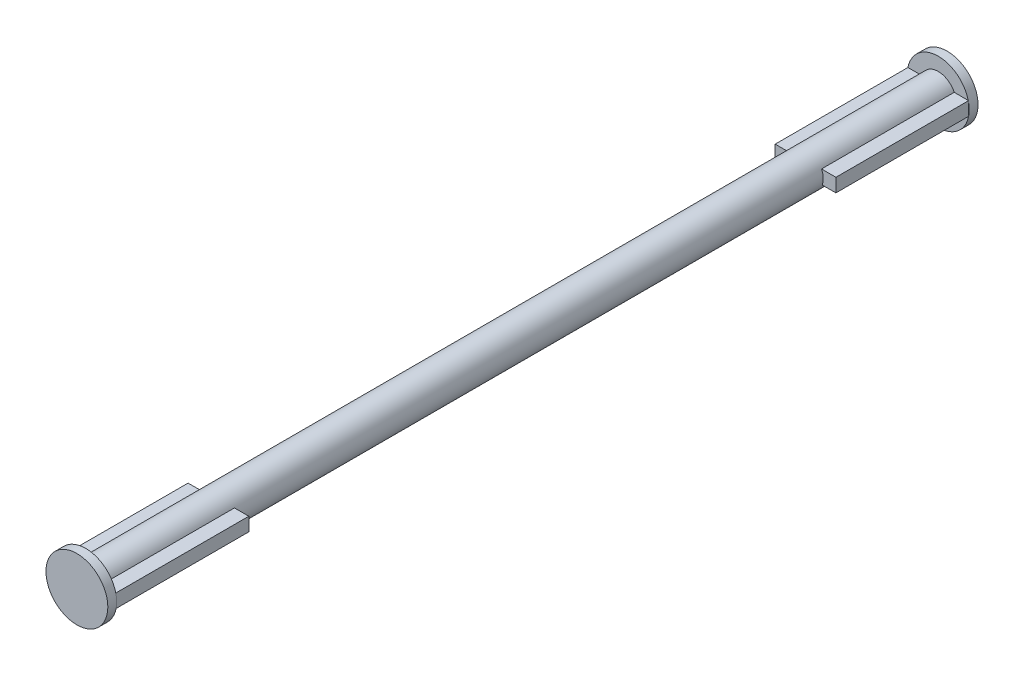
ISO-10303-21;
HEADER;
FILE_DESCRIPTION(('STEP AP214'),'2;1');
FILE_NAME('part.step','',(''),(''),'','','');
FILE_SCHEMA(('AUTOMOTIVE_DESIGN { 1 0 10303 214 1 1 1 1 }'));
ENDSEC;
DATA;
#1=APPLICATION_CONTEXT('core data for automotive mechanical design processes');
#2=APPLICATION_PROTOCOL_DEFINITION('international standard','automotive_design',2000,#1);
#3=PRODUCT_CONTEXT('',#1,'mechanical');
#4=PRODUCT('Part','Part','',(#3));
#5=PRODUCT_RELATED_PRODUCT_CATEGORY('part','',(#4));
#6=PRODUCT_DEFINITION_FORMATION('','',#4);
#7=PRODUCT_DEFINITION_CONTEXT('part definition',#1,'design');
#8=PRODUCT_DEFINITION('design','',#6,#7);
#9=PRODUCT_DEFINITION_SHAPE('','',#8);
#10=(LENGTH_UNIT() NAMED_UNIT(*) SI_UNIT(.MILLI.,.METRE.));
#11=(NAMED_UNIT(*) PLANE_ANGLE_UNIT() SI_UNIT($,.RADIAN.));
#12=(NAMED_UNIT(*) SI_UNIT($,.STERADIAN.) SOLID_ANGLE_UNIT());
#13=UNCERTAINTY_MEASURE_WITH_UNIT(LENGTH_MEASURE(1.E-05),#10,'distance_accuracy_value','');
#14=(GEOMETRIC_REPRESENTATION_CONTEXT(3) GLOBAL_UNCERTAINTY_ASSIGNED_CONTEXT((#13)) GLOBAL_UNIT_ASSIGNED_CONTEXT((#10,
#11,#12)) REPRESENTATION_CONTEXT('',''));
#15=CARTESIAN_POINT('',(0.,0.,0.));
#16=DIRECTION('',(0.,0.,1.));
#17=DIRECTION('',(1.,0.,0.));
#18=AXIS2_PLACEMENT_3D('',#15,#16,#17);
#19=CARTESIAN_POINT('',(0.,0.,0.));
#20=DIRECTION('',(0.,0.,1.));
#21=DIRECTION('',(1.,0.,0.));
#22=AXIS2_PLACEMENT_3D('',#19,#20,#21);
#23=PLANE('',#22);
#24=CARTESIAN_POINT('',(0.,0.,0.));
#25=DIRECTION('',(0.,0.,-1.));
#26=DIRECTION('',(-1.,0.,0.));
#27=AXIS2_PLACEMENT_3D('',#24,#25,#26);
#28=CIRCLE('',#27,17.4831232844675);
#29=CARTESIAN_POINT('',(16.9469713382279,4.29648254286825,0.));
#30=VERTEX_POINT('',#29);
#31=CARTESIAN_POINT('',(17.1568264225371,3.36197960832941,0.));
#32=VERTEX_POINT('',#31);
#33=EDGE_CURVE('E11',#30,#32,#28,.T.);
#34=ORIENTED_EDGE('',*,*,#33,.F.);
#35=DIRECTION('',(-1.,0.,0.));
#36=VECTOR('',#35,1.);
#37=CARTESIAN_POINT('',(9.02996333097917,4.29648254286825,0.));
#38=LINE('',#37,#36);
#39=CARTESIAN_POINT('',(17.1568264225371,4.29648254286825,0.));
#40=VERTEX_POINT('',#39);
#41=EDGE_CURVE('E249',#40,#30,#38,.T.);
#42=ORIENTED_EDGE('',*,*,#41,.F.);
#43=DIRECTION('',(0.,1.,0.));
#44=VECTOR('',#43,1.);
#45=CARTESIAN_POINT('',(17.1568264225371,4.29648254286825,0.));
#46=LINE('',#45,#44);
#47=EDGE_CURVE('E59',#32,#40,#46,.T.);
#48=ORIENTED_EDGE('',*,*,#47,.F.);
#49=EDGE_LOOP('',(#34,#42,#48));
#50=FACE_BOUND('',#49,.T.);
#51=ADVANCED_FACE('F34',(#50),#23,.F.);
#52=CARTESIAN_POINT('',(0.,0.,481.8));
#53=DIRECTION('',(0.,0.,1.));
#54=DIRECTION('',(1.,0.,0.));
#55=AXIS2_PLACEMENT_3D('',#52,#53,#54);
#56=PLANE('',#55);
#57=CARTESIAN_POINT('',(0.,0.,481.8));
#58=DIRECTION('',(0.,0.,1.));
#59=DIRECTION('',(1.,0.,0.));
#60=AXIS2_PLACEMENT_3D('',#57,#58,#59);
#61=CIRCLE('',#60,17.4831232844682);
#62=CARTESIAN_POINT('',(17.1568264225371,3.36197960833326,481.8));
#63=VERTEX_POINT('',#62);
#64=CARTESIAN_POINT('',(16.9469713382286,4.29648254286825,481.8));
#65=VERTEX_POINT('',#64);
#66=EDGE_CURVE('E206',#63,#65,#61,.T.);
#67=ORIENTED_EDGE('',*,*,#66,.F.);
#68=DIRECTION('',(0.,1.,0.));
#69=VECTOR('',#68,1.);
#70=CARTESIAN_POINT('',(17.1568264225371,4.29648254286825,481.8));
#71=LINE('',#70,#69);
#72=CARTESIAN_POINT('',(17.1568264225371,4.29648254286825,481.8));
#73=VERTEX_POINT('',#72);
#74=EDGE_CURVE('E325',#63,#73,#71,.T.);
#75=ORIENTED_EDGE('',*,*,#74,.T.);
#76=DIRECTION('',(-1.,0.,0.));
#77=VECTOR('',#76,1.);
#78=CARTESIAN_POINT('',(9.02996333097916,4.29648254286825,481.8));
#79=LINE('',#78,#77);
#80=EDGE_CURVE('E317',#73,#65,#79,.T.);
#81=ORIENTED_EDGE('',*,*,#80,.T.);
#82=EDGE_LOOP('',(#67,#75,#81));
#83=FACE_BOUND('',#82,.T.);
#84=ADVANCED_FACE('F388',(#83),#56,.T.);
#85=CARTESIAN_POINT('',(0.,0.,481.8));
#86=DIRECTION('',(0.,0.,-1.));
#87=DIRECTION('',(-1.,0.,0.));
#88=AXIS2_PLACEMENT_3D('',#85,#86,#87);
#89=CYLINDRICAL_SURFACE('',#88,10.);
#90=CARTESIAN_POINT('',(0.,0.,481.8));
#91=DIRECTION('',(0.,0.,1.));
#92=DIRECTION('',(1.,0.,0.));
#93=AXIS2_PLACEMENT_3D('',#90,#91,#92);
#94=CIRCLE('',#93,10.);
#95=CARTESIAN_POINT('',(-9.02996333097932,-4.29648254286793,481.8));
#96=VERTEX_POINT('',#95);
#97=CARTESIAN_POINT('',(9.41791341609973,-3.36197960833327,481.8));
#98=VERTEX_POINT('',#97);
#99=EDGE_CURVE('E270',#96,#98,#94,.T.);
#100=ORIENTED_EDGE('',*,*,#99,.F.);
#101=DIRECTION('',(0.,0.,1.));
#102=VECTOR('',#101,1.);
#103=CARTESIAN_POINT('',(-9.02996333097813,-4.29648254286793,406.8));
#104=LINE('',#103,#102);
#105=CARTESIAN_POINT('',(-9.02996333097813,-4.29648254286793,406.8));
#106=VERTEX_POINT('',#105);
#107=EDGE_CURVE('E328',#106,#96,#104,.T.);
#108=ORIENTED_EDGE('',*,*,#107,.F.);
#109=CARTESIAN_POINT('',(2.8117583496154E-13,0.,406.8));
#110=DIRECTION('',(0.,0.,-1.));
#111=DIRECTION('',(1.,0.,0.));
#112=AXIS2_PLACEMENT_3D('',#109,#110,#111);
#113=CIRCLE('',#112,9.99999999999918);
#114=CARTESIAN_POINT('',(-9.41791341609846,3.36197960833361,406.8));
#115=VERTEX_POINT('',#114);
#116=EDGE_CURVE('E351',#106,#115,#113,.T.);
#117=ORIENTED_EDGE('',*,*,#116,.T.);
#118=DIRECTION('',(0.,0.,1.));
#119=VECTOR('',#118,1.);
#120=CARTESIAN_POINT('',(-9.41791341609846,3.36197960833361,406.8));
#121=LINE('',#120,#119);
#122=CARTESIAN_POINT('',(-9.41791341609846,3.36197960833361,481.8));
#123=VERTEX_POINT('',#122);
#124=EDGE_CURVE('E339',#115,#123,#121,.T.);
#125=ORIENTED_EDGE('',*,*,#124,.T.);
#126=CARTESIAN_POINT('',(9.02996333097916,4.29648254286825,481.8));
#127=VERTEX_POINT('',#126);
#128=EDGE_CURVE('E204',#127,#123,#94,.T.);
#129=ORIENTED_EDGE('',*,*,#128,.F.);
#130=DIRECTION('',(0.,0.,1.));
#131=VECTOR('',#130,1.);
#132=CARTESIAN_POINT('',(9.02996333097916,4.29648254286825,406.8));
#133=LINE('',#132,#131);
#134=CARTESIAN_POINT('',(9.02996333097916,4.29648254286825,406.8));
#135=VERTEX_POINT('',#134);
#136=EDGE_CURVE('E297',#135,#127,#133,.T.);
#137=ORIENTED_EDGE('',*,*,#136,.F.);
#138=CARTESIAN_POINT('',(2.8117583496154E-13,0.,406.8));
#139=DIRECTION('',(0.,0.,-1.));
#140=DIRECTION('',(1.,0.,0.));
#141=AXIS2_PLACEMENT_3D('',#138,#139,#140);
#142=CIRCLE('',#141,9.99999999999974);
#143=CARTESIAN_POINT('',(9.41791341609973,-3.36197960833327,406.8));
#144=VERTEX_POINT('',#143);
#145=EDGE_CURVE('E320',#135,#144,#142,.T.);
#146=ORIENTED_EDGE('',*,*,#145,.T.);
#147=DIRECTION('',(0.,0.,1.));
#148=VECTOR('',#147,1.);
#149=CARTESIAN_POINT('',(9.41791341609973,-3.36197960833327,406.8));
#150=LINE('',#149,#148);
#151=EDGE_CURVE('E309',#144,#98,#150,.T.);
#152=ORIENTED_EDGE('',*,*,#151,.T.);
#153=EDGE_LOOP('',(#100,#108,#117,#125,#129,#137,#146,#152));
#154=FACE_BOUND('',#153,.T.);
#155=DIRECTION('',(0.,0.,-1.));
#156=VECTOR('',#155,1.);
#157=CARTESIAN_POINT('',(-9.41791341609781,3.36197960833656,75.));
#158=LINE('',#157,#156);
#159=CARTESIAN_POINT('',(-9.41791341609847,3.3619796083368,75.));
#160=VERTEX_POINT('',#159);
#161=CARTESIAN_POINT('',(-9.41791341609855,3.36197960833656,0.));
#162=VERTEX_POINT('',#161);
#163=EDGE_CURVE('E242',#160,#162,#158,.T.);
#164=ORIENTED_EDGE('',*,*,#163,.F.);
#165=CARTESIAN_POINT('',(3.81639164714898E-13,0.,75.));
#166=DIRECTION('',(0.,0.,-1.));
#167=DIRECTION('',(-1.,0.,0.));
#168=AXIS2_PLACEMENT_3D('',#165,#166,#167);
#169=CIRCLE('',#168,9.99999999999965);
#170=CARTESIAN_POINT('',(-9.02996333098052,-4.2964825428654,75.));
#171=VERTEX_POINT('',#170);
#172=EDGE_CURVE('E233',#171,#160,#169,.T.);
#173=ORIENTED_EDGE('',*,*,#172,.F.);
#174=DIRECTION('',(0.,0.,-1.));
#175=VECTOR('',#174,1.);
#176=CARTESIAN_POINT('',(-9.02996333097988,-4.2964825428651,75.));
#177=LINE('',#176,#175);
#178=CARTESIAN_POINT('',(-9.02996333097988,-4.2964825428651,0.));
#179=VERTEX_POINT('',#178);
#180=EDGE_CURVE('E236',#171,#179,#177,.T.);
#181=ORIENTED_EDGE('',*,*,#180,.T.);
#182=CARTESIAN_POINT('',(0.,0.,0.));
#183=DIRECTION('',(0.,0.,1.));
#184=DIRECTION('',(1.,0.,0.));
#185=AXIS2_PLACEMENT_3D('',#182,#183,#184);
#186=CIRCLE('',#185,10.);
#187=CARTESIAN_POINT('',(9.41791341609973,-3.36197960833327,0.));
#188=VERTEX_POINT('',#187);
#189=EDGE_CURVE('E228',#179,#188,#186,.T.);
#190=ORIENTED_EDGE('',*,*,#189,.T.);
#191=DIRECTION('',(0.,0.,-1.));
#192=VECTOR('',#191,1.);
#193=CARTESIAN_POINT('',(9.41791341609973,-3.36197960833327,75.));
#194=LINE('',#193,#192);
#195=CARTESIAN_POINT('',(9.41791341609973,-3.36197960833327,75.));
#196=VERTEX_POINT('',#195);
#197=EDGE_CURVE('E267',#196,#188,#194,.T.);
#198=ORIENTED_EDGE('',*,*,#197,.F.);
#199=CARTESIAN_POINT('',(3.81639164714898E-13,0.,75.));
#200=DIRECTION('',(0.,0.,-1.));
#201=DIRECTION('',(-1.,0.,0.));
#202=AXIS2_PLACEMENT_3D('',#199,#200,#201);
#203=CIRCLE('',#202,9.99999999999965);
#204=CARTESIAN_POINT('',(9.02996333097916,4.29648254286825,75.));
#205=VERTEX_POINT('',#204);
#206=EDGE_CURVE('E245',#205,#196,#203,.T.);
#207=ORIENTED_EDGE('',*,*,#206,.F.);
#208=DIRECTION('',(0.,0.,-1.));
#209=VECTOR('',#208,1.);
#210=CARTESIAN_POINT('',(9.02996333097917,4.29648254286825,75.));
#211=LINE('',#210,#209);
#212=CARTESIAN_POINT('',(9.02996333097917,4.29648254286825,0.));
#213=VERTEX_POINT('',#212);
#214=EDGE_CURVE('E256',#205,#213,#211,.T.);
#215=ORIENTED_EDGE('',*,*,#214,.T.);
#216=EDGE_CURVE('E38',#213,#162,#186,.T.);
#217=ORIENTED_EDGE('',*,*,#216,.T.);
#218=EDGE_LOOP('',(#164,#173,#181,#190,#198,#207,#215,#217));
#219=FACE_BOUND('',#218,.T.);
#220=ADVANCED_FACE('F36',(#154,#219),#89,.T.);
#221=CARTESIAN_POINT('',(-17.156826422536,-3.36197960833873,481.8));
#222=VERTEX_POINT('',#221);
#223=CARTESIAN_POINT('',(-16.9469713382288,-4.2964825428677,481.8));
#224=VERTEX_POINT('',#223);
#225=EDGE_CURVE('E202',#222,#224,#61,.T.);
#226=ORIENTED_EDGE('',*,*,#225,.F.);
#227=DIRECTION('',(0.,-1.,0.));
#228=VECTOR('',#227,1.);
#229=CARTESIAN_POINT('',(-17.156826422536,-4.29648254286769,481.8));
#230=LINE('',#229,#228);
#231=CARTESIAN_POINT('',(-17.156826422536,-4.29648254286769,481.8));
#232=VERTEX_POINT('',#231);
#233=EDGE_CURVE('E356',#222,#232,#230,.T.);
#234=ORIENTED_EDGE('',*,*,#233,.T.);
#235=DIRECTION('',(1.,0.,0.));
#236=VECTOR('',#235,1.);
#237=CARTESIAN_POINT('',(-9.02996333097813,-4.29648254286793,481.8));
#238=LINE('',#237,#236);
#239=EDGE_CURVE('E349',#232,#224,#238,.T.);
#240=ORIENTED_EDGE('',*,*,#239,.T.);
#241=EDGE_LOOP('',(#226,#234,#240));
#242=FACE_BOUND('',#241,.T.);
#243=ADVANCED_FACE('F420',(#242),#56,.T.);
#244=CARTESIAN_POINT('',(-16.9469713382294,-4.29648254286237,0.));
#245=VERTEX_POINT('',#244);
#246=CARTESIAN_POINT('',(-17.1568264225375,-3.36197960832741,0.));
#247=VERTEX_POINT('',#246);
#248=EDGE_CURVE('E43',#245,#247,#28,.T.);
#249=ORIENTED_EDGE('',*,*,#248,.F.);
#250=DIRECTION('',(1.,-3.44303691993684E-13,0.));
#251=VECTOR('',#250,1.);
#252=CARTESIAN_POINT('',(-9.02996333097988,-4.2964825428651,0.));
#253=LINE('',#252,#251);
#254=CARTESIAN_POINT('',(-17.1568264225378,-4.2964825428623,0.));
#255=VERTEX_POINT('',#254);
#256=EDGE_CURVE('E189',#255,#245,#253,.T.);
#257=ORIENTED_EDGE('',*,*,#256,.F.);
#258=DIRECTION('',(-3.44749256222736E-13,-1.,0.));
#259=VECTOR('',#258,1.);
#260=CARTESIAN_POINT('',(-17.1568264225378,-4.2964825428623,0.));
#261=LINE('',#260,#259);
#262=EDGE_CURVE('E178',#247,#255,#261,.T.);
#263=ORIENTED_EDGE('',*,*,#262,.F.);
#264=EDGE_LOOP('',(#249,#257,#263));
#265=FACE_BOUND('',#264,.T.);
#266=ADVANCED_FACE('F188',(#265),#23,.F.);
#267=CARTESIAN_POINT('',(17.1568264225371,-3.36197960833327,75.));
#268=DIRECTION('',(0.,1.,0.));
#269=DIRECTION('',(-1.,0.,0.));
#270=AXIS2_PLACEMENT_3D('',#267,#268,#269);
#271=PLANE('',#270);
#272=DIRECTION('',(1.,0.,0.));
#273=VECTOR('',#272,1.);
#274=CARTESIAN_POINT('',(17.1568264225371,-3.36197960833327,0.));
#275=LINE('',#274,#273);
#276=CARTESIAN_POINT('',(17.1568264225371,-3.36197960833327,0.));
#277=VERTEX_POINT('',#276);
#278=EDGE_CURVE('E227',#188,#277,#275,.T.);
#279=ORIENTED_EDGE('',*,*,#278,.T.);
#280=DIRECTION('',(0.,0.,-1.));
#281=VECTOR('',#280,1.);
#282=CARTESIAN_POINT('',(17.1568264225371,-3.36197960833327,75.));
#283=LINE('',#282,#281);
#284=CARTESIAN_POINT('',(17.1568264225371,-3.36197960833327,75.));
#285=VERTEX_POINT('',#284);
#286=EDGE_CURVE('E265',#285,#277,#283,.T.);
#287=ORIENTED_EDGE('',*,*,#286,.F.);
#288=DIRECTION('',(1.,0.,0.));
#289=VECTOR('',#288,1.);
#290=CARTESIAN_POINT('',(17.1568264225371,-3.36197960833327,75.));
#291=LINE('',#290,#289);
#292=EDGE_CURVE('E248',#196,#285,#291,.T.);
#293=ORIENTED_EDGE('',*,*,#292,.F.);
#294=ORIENTED_EDGE('',*,*,#197,.T.);
#295=EDGE_LOOP('',(#279,#287,#293,#294));
#296=FACE_BOUND('',#295,.T.);
#297=ADVANCED_FACE('F284',(#296),#271,.F.);
#298=CARTESIAN_POINT('',(17.1568264225371,4.29648254286825,75.));
#299=DIRECTION('',(-1.,0.,0.));
#300=DIRECTION('',(0.,0.,1.));
#301=AXIS2_PLACEMENT_3D('',#298,#299,#300);
#302=PLANE('',#301);
#303=EDGE_CURVE('E217',#277,#32,#46,.T.);
#304=ORIENTED_EDGE('',*,*,#303,.T.);
#305=ORIENTED_EDGE('',*,*,#47,.T.);
#306=DIRECTION('',(0.,0.,-1.));
#307=VECTOR('',#306,1.);
#308=CARTESIAN_POINT('',(17.1568264225371,4.29648254286825,75.));
#309=LINE('',#308,#307);
#310=CARTESIAN_POINT('',(17.1568264225371,4.29648254286825,75.));
#311=VERTEX_POINT('',#310);
#312=EDGE_CURVE('E262',#311,#40,#309,.T.);
#313=ORIENTED_EDGE('',*,*,#312,.F.);
#314=DIRECTION('',(0.,1.,0.));
#315=VECTOR('',#314,1.);
#316=CARTESIAN_POINT('',(17.1568264225371,4.29648254286825,75.));
#317=LINE('',#316,#315);
#318=EDGE_CURVE('E251',#285,#311,#317,.T.);
#319=ORIENTED_EDGE('',*,*,#318,.F.);
#320=ORIENTED_EDGE('',*,*,#286,.T.);
#321=EDGE_LOOP('',(#304,#305,#313,#319,#320));
#322=FACE_BOUND('',#321,.T.);
#323=ADVANCED_FACE('F434',(#322),#302,.F.);
#324=CARTESIAN_POINT('',(9.02996333097917,4.29648254286825,75.));
#325=DIRECTION('',(0.,-1.,0.));
#326=DIRECTION('',(0.,0.,-1.));
#327=AXIS2_PLACEMENT_3D('',#324,#325,#326);
#328=PLANE('',#327);
#329=ORIENTED_EDGE('',*,*,#41,.T.);
#330=EDGE_CURVE('E220',#30,#213,#38,.T.);
#331=ORIENTED_EDGE('',*,*,#330,.T.);
#332=ORIENTED_EDGE('',*,*,#214,.F.);
#333=DIRECTION('',(-1.,0.,0.));
#334=VECTOR('',#333,1.);
#335=CARTESIAN_POINT('',(9.02996333097917,4.29648254286825,75.));
#336=LINE('',#335,#334);
#337=EDGE_CURVE('E253',#311,#205,#336,.T.);
#338=ORIENTED_EDGE('',*,*,#337,.F.);
#339=ORIENTED_EDGE('',*,*,#312,.T.);
#340=EDGE_LOOP('',(#329,#331,#332,#338,#339));
#341=FACE_BOUND('',#340,.T.);
#342=ADVANCED_FACE('F432',(#341),#328,.F.);
#343=CARTESIAN_POINT('',(3.81639164714898E-13,0.,75.));
#344=DIRECTION('',(0.,0.,-1.));
#345=DIRECTION('',(-1.,0.,0.));
#346=AXIS2_PLACEMENT_3D('',#343,#344,#345);
#347=PLANE('',#346);
#348=ORIENTED_EDGE('',*,*,#206,.T.);
#349=ORIENTED_EDGE('',*,*,#292,.T.);
#350=ORIENTED_EDGE('',*,*,#318,.T.);
#351=ORIENTED_EDGE('',*,*,#337,.T.);
#352=EDGE_LOOP('',(#348,#349,#350,#351));
#353=FACE_BOUND('',#352,.T.);
#354=ADVANCED_FACE('F288',(#353),#347,.F.);
#355=CARTESIAN_POINT('',(-17.1568264225351,3.36197960833922,75.));
#356=DIRECTION('',(-3.4413543791978E-13,-1.,0.));
#357=DIRECTION('',(1.,-3.4413543791978E-13,0.));
#358=AXIS2_PLACEMENT_3D('',#355,#356,#357);
#359=PLANE('',#358);
#360=DIRECTION('',(-1.,3.4413543791978E-13,0.));
#361=VECTOR('',#360,1.);
#362=CARTESIAN_POINT('',(-17.1568264225351,3.36197960833922,0.));
#363=LINE('',#362,#361);
#364=CARTESIAN_POINT('',(-17.1568264225351,3.36197960833922,0.));
#365=VERTEX_POINT('',#364);
#366=EDGE_CURVE('E190',#162,#365,#363,.T.);
#367=ORIENTED_EDGE('',*,*,#366,.T.);
#368=DIRECTION('',(0.,0.,-1.));
#369=VECTOR('',#368,1.);
#370=CARTESIAN_POINT('',(-17.1568264225351,3.36197960833922,75.));
#371=LINE('',#370,#369);
#372=CARTESIAN_POINT('',(-17.1568264225351,3.36197960833922,75.));
#373=VERTEX_POINT('',#372);
#374=EDGE_CURVE('E182',#373,#365,#371,.T.);
#375=ORIENTED_EDGE('',*,*,#374,.F.);
#376=DIRECTION('',(-1.,3.4413543791978E-13,0.));
#377=VECTOR('',#376,1.);
#378=CARTESIAN_POINT('',(-17.1568264225351,3.36197960833922,75.));
#379=LINE('',#378,#377);
#380=EDGE_CURVE('E305',#160,#373,#379,.T.);
#381=ORIENTED_EDGE('',*,*,#380,.F.);
#382=ORIENTED_EDGE('',*,*,#163,.T.);
#383=EDGE_LOOP('',(#367,#375,#381,#382));
#384=FACE_BOUND('',#383,.T.);
#385=ADVANCED_FACE('F445',(#384),#359,.F.);
#386=CARTESIAN_POINT('',(-17.1568264225378,-4.2964825428623,75.));
#387=DIRECTION('',(1.,-3.44749256222736E-13,0.));
#388=DIRECTION('',(3.44749256222736E-13,1.,0.));
#389=AXIS2_PLACEMENT_3D('',#386,#387,#388);
#390=PLANE('',#389);
#391=EDGE_CURVE('E175',#365,#247,#261,.T.);
#392=ORIENTED_EDGE('',*,*,#391,.T.);
#393=ORIENTED_EDGE('',*,*,#262,.T.);
#394=DIRECTION('',(0.,0.,-1.));
#395=VECTOR('',#394,1.);
#396=CARTESIAN_POINT('',(-17.1568264225378,-4.2964825428623,75.));
#397=LINE('',#396,#395);
#398=CARTESIAN_POINT('',(-17.1568264225378,-4.2964825428623,75.));
#399=VERTEX_POINT('',#398);
#400=EDGE_CURVE('E238',#399,#255,#397,.T.);
#401=ORIENTED_EDGE('',*,*,#400,.F.);
#402=DIRECTION('',(-3.44749256222736E-13,-1.,0.));
#403=VECTOR('',#402,1.);
#404=CARTESIAN_POINT('',(-17.1568264225378,-4.2964825428623,75.));
#405=LINE('',#404,#403);
#406=EDGE_CURVE('E303',#373,#399,#405,.T.);
#407=ORIENTED_EDGE('',*,*,#406,.F.);
#408=ORIENTED_EDGE('',*,*,#374,.T.);
#409=EDGE_LOOP('',(#392,#393,#401,#407,#408));
#410=FACE_BOUND('',#409,.T.);
#411=ADVANCED_FACE('F176',(#410),#390,.F.);
#412=CARTESIAN_POINT('',(-9.02996333097988,-4.2964825428651,75.));
#413=DIRECTION('',(3.44303691993684E-13,1.,0.));
#414=DIRECTION('',(-1.,3.44303691993684E-13,0.));
#415=AXIS2_PLACEMENT_3D('',#412,#413,#414);
#416=PLANE('',#415);
#417=ORIENTED_EDGE('',*,*,#256,.T.);
#418=EDGE_CURVE('E186',#245,#179,#253,.T.);
#419=ORIENTED_EDGE('',*,*,#418,.T.);
#420=ORIENTED_EDGE('',*,*,#180,.F.);
#421=DIRECTION('',(1.,-3.44303691993684E-13,0.));
#422=VECTOR('',#421,1.);
#423=CARTESIAN_POINT('',(-9.02996333097988,-4.2964825428651,75.));
#424=LINE('',#423,#422);
#425=EDGE_CURVE('E239',#399,#171,#424,.T.);
#426=ORIENTED_EDGE('',*,*,#425,.F.);
#427=ORIENTED_EDGE('',*,*,#400,.T.);
#428=EDGE_LOOP('',(#417,#419,#420,#426,#427));
#429=FACE_BOUND('',#428,.T.);
#430=ADVANCED_FACE('F450',(#429),#416,.F.);
#431=CARTESIAN_POINT('',(3.81639164714898E-13,0.,75.));
#432=DIRECTION('',(0.,0.,-1.));
#433=DIRECTION('',(-1.,0.,0.));
#434=AXIS2_PLACEMENT_3D('',#431,#432,#433);
#435=PLANE('',#434);
#436=ORIENTED_EDGE('',*,*,#172,.T.);
#437=ORIENTED_EDGE('',*,*,#380,.T.);
#438=ORIENTED_EDGE('',*,*,#406,.T.);
#439=ORIENTED_EDGE('',*,*,#425,.T.);
#440=EDGE_LOOP('',(#436,#437,#438,#439));
#441=FACE_BOUND('',#440,.T.);
#442=ADVANCED_FACE('F453',(#441),#435,.F.);
#443=CARTESIAN_POINT('',(9.02996333097916,4.29648254286825,406.8));
#444=DIRECTION('',(0.,1.,0.));
#445=DIRECTION('',(-1.,0.,0.));
#446=AXIS2_PLACEMENT_3D('',#443,#444,#445);
#447=PLANE('',#446);
#448=ORIENTED_EDGE('',*,*,#80,.F.);
#449=DIRECTION('',(0.,0.,1.));
#450=VECTOR('',#449,1.);
#451=CARTESIAN_POINT('',(17.1568264225371,4.29648254286825,406.8));
#452=LINE('',#451,#450);
#453=CARTESIAN_POINT('',(17.1568264225371,4.29648254286825,406.8));
#454=VERTEX_POINT('',#453);
#455=EDGE_CURVE('E298',#454,#73,#452,.T.);
#456=ORIENTED_EDGE('',*,*,#455,.F.);
#457=DIRECTION('',(-1.,0.,0.));
#458=VECTOR('',#457,1.);
#459=CARTESIAN_POINT('',(9.02996333097916,4.29648254286825,406.8));
#460=LINE('',#459,#458);
#461=EDGE_CURVE('E313',#454,#135,#460,.T.);
#462=ORIENTED_EDGE('',*,*,#461,.T.);
#463=ORIENTED_EDGE('',*,*,#136,.T.);
#464=EDGE_CURVE('E321',#65,#127,#79,.T.);
#465=ORIENTED_EDGE('',*,*,#464,.F.);
#466=EDGE_LOOP('',(#448,#456,#462,#463,#465));
#467=FACE_BOUND('',#466,.T.);
#468=ADVANCED_FACE('F456',(#467),#447,.T.);
#469=CARTESIAN_POINT('',(17.1568264225371,4.29648254286825,406.8));
#470=DIRECTION('',(1.,0.,0.));
#471=DIRECTION('',(0.,0.,-1.));
#472=AXIS2_PLACEMENT_3D('',#469,#470,#471);
#473=PLANE('',#472);
#474=CARTESIAN_POINT('',(17.1568264225371,-3.36197960833327,481.8));
#475=VERTEX_POINT('',#474);
#476=EDGE_CURVE('E322',#475,#63,#71,.T.);
#477=ORIENTED_EDGE('',*,*,#476,.F.);
#478=DIRECTION('',(0.,0.,1.));
#479=VECTOR('',#478,1.);
#480=CARTESIAN_POINT('',(17.1568264225371,-3.36197960833327,406.8));
#481=LINE('',#480,#479);
#482=CARTESIAN_POINT('',(17.1568264225371,-3.36197960833327,406.8));
#483=VERTEX_POINT('',#482);
#484=EDGE_CURVE('E312',#483,#475,#481,.T.);
#485=ORIENTED_EDGE('',*,*,#484,.F.);
#486=DIRECTION('',(0.,1.,0.));
#487=VECTOR('',#486,1.);
#488=CARTESIAN_POINT('',(17.1568264225371,4.29648254286825,406.8));
#489=LINE('',#488,#487);
#490=EDGE_CURVE('E331',#483,#454,#489,.T.);
#491=ORIENTED_EDGE('',*,*,#490,.T.);
#492=ORIENTED_EDGE('',*,*,#455,.T.);
#493=ORIENTED_EDGE('',*,*,#74,.F.);
#494=EDGE_LOOP('',(#477,#485,#491,#492,#493));
#495=FACE_BOUND('',#494,.T.);
#496=ADVANCED_FACE('F392',(#495),#473,.T.);
#497=CARTESIAN_POINT('',(17.1568264225371,-3.36197960833327,406.8));
#498=DIRECTION('',(0.,-1.,0.));
#499=DIRECTION('',(1.,0.,0.));
#500=AXIS2_PLACEMENT_3D('',#497,#498,#499);
#501=PLANE('',#500);
#502=DIRECTION('',(1.,0.,0.));
#503=VECTOR('',#502,1.);
#504=CARTESIAN_POINT('',(17.1568264225371,-3.36197960833327,481.8));
#505=LINE('',#504,#503);
#506=EDGE_CURVE('E326',#98,#475,#505,.T.);
#507=ORIENTED_EDGE('',*,*,#506,.F.);
#508=ORIENTED_EDGE('',*,*,#151,.F.);
#509=DIRECTION('',(1.,0.,0.));
#510=VECTOR('',#509,1.);
#511=CARTESIAN_POINT('',(17.1568264225371,-3.36197960833327,406.8));
#512=LINE('',#511,#510);
#513=EDGE_CURVE('E334',#144,#483,#512,.T.);
#514=ORIENTED_EDGE('',*,*,#513,.T.);
#515=ORIENTED_EDGE('',*,*,#484,.T.);
#516=EDGE_LOOP('',(#507,#508,#514,#515));
#517=FACE_BOUND('',#516,.T.);
#518=ADVANCED_FACE('F458',(#517),#501,.T.);
#519=CARTESIAN_POINT('',(2.8117583496154E-13,0.,406.8));
#520=DIRECTION('',(0.,0.,1.));
#521=DIRECTION('',(1.,0.,0.));
#522=AXIS2_PLACEMENT_3D('',#519,#520,#521);
#523=PLANE('',#522);
#524=ORIENTED_EDGE('',*,*,#145,.F.);
#525=ORIENTED_EDGE('',*,*,#461,.F.);
#526=ORIENTED_EDGE('',*,*,#490,.F.);
#527=ORIENTED_EDGE('',*,*,#513,.F.);
#528=EDGE_LOOP('',(#524,#525,#526,#527));
#529=FACE_BOUND('',#528,.T.);
#530=ADVANCED_FACE('F461',(#529),#523,.F.);
#531=CARTESIAN_POINT('',(-9.02996333097813,-4.29648254286793,406.8));
#532=DIRECTION('',(0.,-1.,0.));
#533=DIRECTION('',(1.,0.,0.));
#534=AXIS2_PLACEMENT_3D('',#531,#532,#533);
#535=PLANE('',#534);
#536=ORIENTED_EDGE('',*,*,#239,.F.);
#537=DIRECTION('',(0.,0.,1.));
#538=VECTOR('',#537,1.);
#539=CARTESIAN_POINT('',(-17.156826422536,-4.29648254286769,406.8));
#540=LINE('',#539,#538);
#541=CARTESIAN_POINT('',(-17.156826422536,-4.29648254286769,406.8));
#542=VERTEX_POINT('',#541);
#543=EDGE_CURVE('E345',#542,#232,#540,.T.);
#544=ORIENTED_EDGE('',*,*,#543,.F.);
#545=DIRECTION('',(1.,0.,0.));
#546=VECTOR('',#545,1.);
#547=CARTESIAN_POINT('',(-9.02996333097813,-4.29648254286793,406.8));
#548=LINE('',#547,#546);
#549=EDGE_CURVE('E343',#542,#106,#548,.T.);
#550=ORIENTED_EDGE('',*,*,#549,.T.);
#551=ORIENTED_EDGE('',*,*,#107,.T.);
#552=EDGE_CURVE('E352',#224,#96,#238,.T.);
#553=ORIENTED_EDGE('',*,*,#552,.F.);
#554=EDGE_LOOP('',(#536,#544,#550,#551,#553));
#555=FACE_BOUND('',#554,.T.);
#556=ADVANCED_FACE('F417',(#555),#535,.T.);
#557=CARTESIAN_POINT('',(-17.156826422536,-4.29648254286769,406.8));
#558=DIRECTION('',(-1.,0.,0.));
#559=DIRECTION('',(0.,-1.,0.));
#560=AXIS2_PLACEMENT_3D('',#557,#558,#559);
#561=PLANE('',#560);
#562=CARTESIAN_POINT('',(-17.1568264225358,3.36197960833384,481.8));
#563=VERTEX_POINT('',#562);
#564=EDGE_CURVE('E353',#563,#222,#230,.T.);
#565=ORIENTED_EDGE('',*,*,#564,.F.);
#566=DIRECTION('',(0.,0.,1.));
#567=VECTOR('',#566,1.);
#568=CARTESIAN_POINT('',(-17.1568264225358,3.36197960833384,406.8));
#569=LINE('',#568,#567);
#570=CARTESIAN_POINT('',(-17.1568264225358,3.36197960833384,406.8));
#571=VERTEX_POINT('',#570);
#572=EDGE_CURVE('E342',#571,#563,#569,.T.);
#573=ORIENTED_EDGE('',*,*,#572,.F.);
#574=DIRECTION('',(0.,-1.,0.));
#575=VECTOR('',#574,1.);
#576=CARTESIAN_POINT('',(-17.156826422536,-4.29648254286769,406.8));
#577=LINE('',#576,#575);
#578=EDGE_CURVE('E362',#571,#542,#577,.T.);
#579=ORIENTED_EDGE('',*,*,#578,.T.);
#580=ORIENTED_EDGE('',*,*,#543,.T.);
#581=ORIENTED_EDGE('',*,*,#233,.F.);
#582=EDGE_LOOP('',(#565,#573,#579,#580,#581));
#583=FACE_BOUND('',#582,.T.);
#584=ADVANCED_FACE('F403',(#583),#561,.T.);
#585=CARTESIAN_POINT('',(-17.1568264225358,3.36197960833384,406.8));
#586=DIRECTION('',(0.,1.,0.));
#587=DIRECTION('',(-1.,0.,0.));
#588=AXIS2_PLACEMENT_3D('',#585,#586,#587);
#589=PLANE('',#588);
#590=DIRECTION('',(-1.,0.,0.));
#591=VECTOR('',#590,1.);
#592=CARTESIAN_POINT('',(-17.1568264225358,3.36197960833384,481.8));
#593=LINE('',#592,#591);
#594=EDGE_CURVE('E357',#123,#563,#593,.T.);
#595=ORIENTED_EDGE('',*,*,#594,.F.);
#596=ORIENTED_EDGE('',*,*,#124,.F.);
#597=DIRECTION('',(-1.,0.,0.));
#598=VECTOR('',#597,1.);
#599=CARTESIAN_POINT('',(-17.1568264225358,3.36197960833384,406.8));
#600=LINE('',#599,#598);
#601=EDGE_CURVE('E365',#115,#571,#600,.T.);
#602=ORIENTED_EDGE('',*,*,#601,.T.);
#603=ORIENTED_EDGE('',*,*,#572,.T.);
#604=EDGE_LOOP('',(#595,#596,#602,#603));
#605=FACE_BOUND('',#604,.T.);
#606=ADVANCED_FACE('F407',(#605),#589,.T.);
#607=CARTESIAN_POINT('',(2.8117583496154E-13,0.,406.8));
#608=DIRECTION('',(0.,0.,1.));
#609=DIRECTION('',(1.,0.,0.));
#610=AXIS2_PLACEMENT_3D('',#607,#608,#609);
#611=PLANE('',#610);
#612=ORIENTED_EDGE('',*,*,#116,.F.);
#613=ORIENTED_EDGE('',*,*,#549,.F.);
#614=ORIENTED_EDGE('',*,*,#578,.F.);
#615=ORIENTED_EDGE('',*,*,#601,.F.);
#616=EDGE_LOOP('',(#612,#613,#614,#615));
#617=FACE_BOUND('',#616,.T.);
#618=ADVANCED_FACE('F414',(#617),#611,.F.);
#619=CARTESIAN_POINT('',(0.,0.,481.8));
#620=DIRECTION('',(0.,0.,1.));
#621=DIRECTION('',(1.,0.,0.));
#622=AXIS2_PLACEMENT_3D('',#619,#620,#621);
#623=PLANE('',#622);
#624=EDGE_CURVE('E395',#224,#475,#61,.T.);
#625=ORIENTED_EDGE('',*,*,#624,.F.);
#626=ORIENTED_EDGE('',*,*,#552,.T.);
#627=ORIENTED_EDGE('',*,*,#99,.T.);
#628=ORIENTED_EDGE('',*,*,#506,.T.);
#629=EDGE_LOOP('',(#625,#626,#627,#628));
#630=FACE_BOUND('',#629,.T.);
#631=ADVANCED_FACE('F478',(#630),#623,.F.);
#632=EDGE_CURVE('E212',#475,#63,#61,.T.);
#633=ORIENTED_EDGE('',*,*,#632,.F.);
#634=ORIENTED_EDGE('',*,*,#476,.T.);
#635=EDGE_LOOP('',(#633,#634));
#636=FACE_BOUND('',#635,.T.);
#637=ADVANCED_FACE('F394',(#636),#623,.F.);
#638=EDGE_CURVE('E397',#563,#222,#61,.T.);
#639=ORIENTED_EDGE('',*,*,#638,.F.);
#640=ORIENTED_EDGE('',*,*,#564,.T.);
#641=EDGE_LOOP('',(#639,#640));
#642=FACE_BOUND('',#641,.T.);
#643=ADVANCED_FACE('F378',(#642),#623,.F.);
#644=CARTESIAN_POINT('',(0.,0.,486.8));
#645=DIRECTION('',(0.,0.,-1.));
#646=DIRECTION('',(-1.,0.,0.));
#647=AXIS2_PLACEMENT_3D('',#644,#645,#646);
#648=CYLINDRICAL_SURFACE('',#647,17.4831232844682);
#649=CARTESIAN_POINT('',(0.,0.,486.8));
#650=DIRECTION('',(0.,0.,1.));
#651=DIRECTION('',(1.,0.,0.));
#652=AXIS2_PLACEMENT_3D('',#649,#650,#651);
#653=CIRCLE('',#652,17.4831232844682);
#654=CARTESIAN_POINT('',(17.4831232844682,0.,486.8));
#655=VERTEX_POINT('',#654);
#656=EDGE_CURVE('E359',#655,#655,#653,.T.);
#657=ORIENTED_EDGE('',*,*,#656,.F.);
#658=EDGE_LOOP('',(#657));
#659=FACE_BOUND('',#658,.T.);
#660=ORIENTED_EDGE('',*,*,#66,.T.);
#661=EDGE_CURVE('E207',#65,#563,#61,.T.);
#662=ORIENTED_EDGE('',*,*,#661,.T.);
#663=ORIENTED_EDGE('',*,*,#638,.T.);
#664=ORIENTED_EDGE('',*,*,#225,.T.);
#665=ORIENTED_EDGE('',*,*,#624,.T.);
#666=ORIENTED_EDGE('',*,*,#632,.T.);
#667=EDGE_LOOP('',(#660,#662,#663,#664,#665,#666));
#668=FACE_BOUND('',#667,.T.);
#669=ADVANCED_FACE('F375',(#659,#668),#648,.T.);
#670=CARTESIAN_POINT('',(0.,0.,486.8));
#671=DIRECTION('',(0.,0.,1.));
#672=DIRECTION('',(1.,0.,0.));
#673=AXIS2_PLACEMENT_3D('',#670,#671,#672);
#674=PLANE('',#673);
#675=ORIENTED_EDGE('',*,*,#656,.T.);
#676=EDGE_LOOP('',(#675));
#677=FACE_BOUND('',#676,.T.);
#678=ADVANCED_FACE('F373',(#677),#674,.T.);
#679=ORIENTED_EDGE('',*,*,#128,.T.);
#680=ORIENTED_EDGE('',*,*,#594,.T.);
#681=ORIENTED_EDGE('',*,*,#661,.F.);
#682=ORIENTED_EDGE('',*,*,#464,.T.);
#683=EDGE_LOOP('',(#679,#680,#681,#682));
#684=FACE_BOUND('',#683,.T.);
#685=ADVANCED_FACE('F405',(#684),#623,.F.);
#686=CARTESIAN_POINT('',(0.,0.,0.));
#687=DIRECTION('',(0.,0.,-1.));
#688=DIRECTION('',(-1.,0.,0.));
#689=AXIS2_PLACEMENT_3D('',#686,#687,#688);
#690=PLANE('',#689);
#691=ORIENTED_EDGE('',*,*,#303,.F.);
#692=EDGE_CURVE('E45',#32,#277,#28,.T.);
#693=ORIENTED_EDGE('',*,*,#692,.F.);
#694=EDGE_LOOP('',(#691,#693));
#695=FACE_BOUND('',#694,.T.);
#696=ADVANCED_FACE('F216',(#695),#690,.F.);
#697=ORIENTED_EDGE('',*,*,#278,.F.);
#698=ORIENTED_EDGE('',*,*,#189,.F.);
#699=ORIENTED_EDGE('',*,*,#418,.F.);
#700=EDGE_CURVE('E196',#277,#245,#28,.T.);
#701=ORIENTED_EDGE('',*,*,#700,.F.);
#702=EDGE_LOOP('',(#697,#698,#699,#701));
#703=FACE_BOUND('',#702,.T.);
#704=ADVANCED_FACE('F225',(#703),#690,.F.);
#705=ORIENTED_EDGE('',*,*,#330,.F.);
#706=EDGE_CURVE('E197',#365,#30,#28,.T.);
#707=ORIENTED_EDGE('',*,*,#706,.F.);
#708=ORIENTED_EDGE('',*,*,#366,.F.);
#709=ORIENTED_EDGE('',*,*,#216,.F.);
#710=EDGE_LOOP('',(#705,#707,#708,#709));
#711=FACE_BOUND('',#710,.T.);
#712=ADVANCED_FACE('F295',(#711),#690,.F.);
#713=CARTESIAN_POINT('',(0.,0.,-5.));
#714=DIRECTION('',(0.,0.,1.));
#715=DIRECTION('',(1.,0.,0.));
#716=AXIS2_PLACEMENT_3D('',#713,#714,#715);
#717=CYLINDRICAL_SURFACE('',#716,17.4831232844675);
#718=CARTESIAN_POINT('',(0.,0.,-5.));
#719=DIRECTION('',(0.,0.,-1.));
#720=DIRECTION('',(-1.,0.,0.));
#721=AXIS2_PLACEMENT_3D('',#718,#719,#720);
#722=CIRCLE('',#721,17.4831232844675);
#723=CARTESIAN_POINT('',(-17.4831232844675,0.,-5.));
#724=VERTEX_POINT('',#723);
#725=EDGE_CURVE('E210',#724,#724,#722,.T.);
#726=ORIENTED_EDGE('',*,*,#725,.F.);
#727=EDGE_LOOP('',(#726));
#728=FACE_BOUND('',#727,.T.);
#729=ORIENTED_EDGE('',*,*,#706,.T.);
#730=ORIENTED_EDGE('',*,*,#33,.T.);
#731=ORIENTED_EDGE('',*,*,#692,.T.);
#732=ORIENTED_EDGE('',*,*,#700,.T.);
#733=ORIENTED_EDGE('',*,*,#248,.T.);
#734=EDGE_CURVE('E191',#247,#365,#28,.T.);
#735=ORIENTED_EDGE('',*,*,#734,.T.);
#736=EDGE_LOOP('',(#729,#730,#731,#732,#733,#735));
#737=FACE_BOUND('',#736,.T.);
#738=ADVANCED_FACE('F199',(#728,#737),#717,.T.);
#739=CARTESIAN_POINT('',(0.,0.,-5.));
#740=DIRECTION('',(0.,0.,-1.));
#741=DIRECTION('',(-1.,0.,0.));
#742=AXIS2_PLACEMENT_3D('',#739,#740,#741);
#743=PLANE('',#742);
#744=ORIENTED_EDGE('',*,*,#725,.T.);
#745=EDGE_LOOP('',(#744));
#746=FACE_BOUND('',#745,.T.);
#747=ADVANCED_FACE('F486',(#746),#743,.T.);
#748=ORIENTED_EDGE('',*,*,#391,.F.);
#749=ORIENTED_EDGE('',*,*,#734,.F.);
#750=EDGE_LOOP('',(#748,#749));
#751=FACE_BOUND('',#750,.T.);
#752=ADVANCED_FACE('F192',(#751),#690,.F.);
#753=CLOSED_SHELL('',(#51,#84,#220,#243,#266,#297,#323,#342,#354,#385,#411,#430,#442,#468,#496,
#518,#530,#556,#584,#606,#618,#631,#637,#643,#669,#678,#685,#696,#704,#712,#738,#747,#752));
#754=MANIFOLD_SOLID_BREP('B2',#753);
#755=ADVANCED_BREP_SHAPE_REPRESENTATION('',(#18,#754),#14);
#756=SHAPE_DEFINITION_REPRESENTATION(#9,#755);
ENDSEC;
END-ISO-10303-21;
